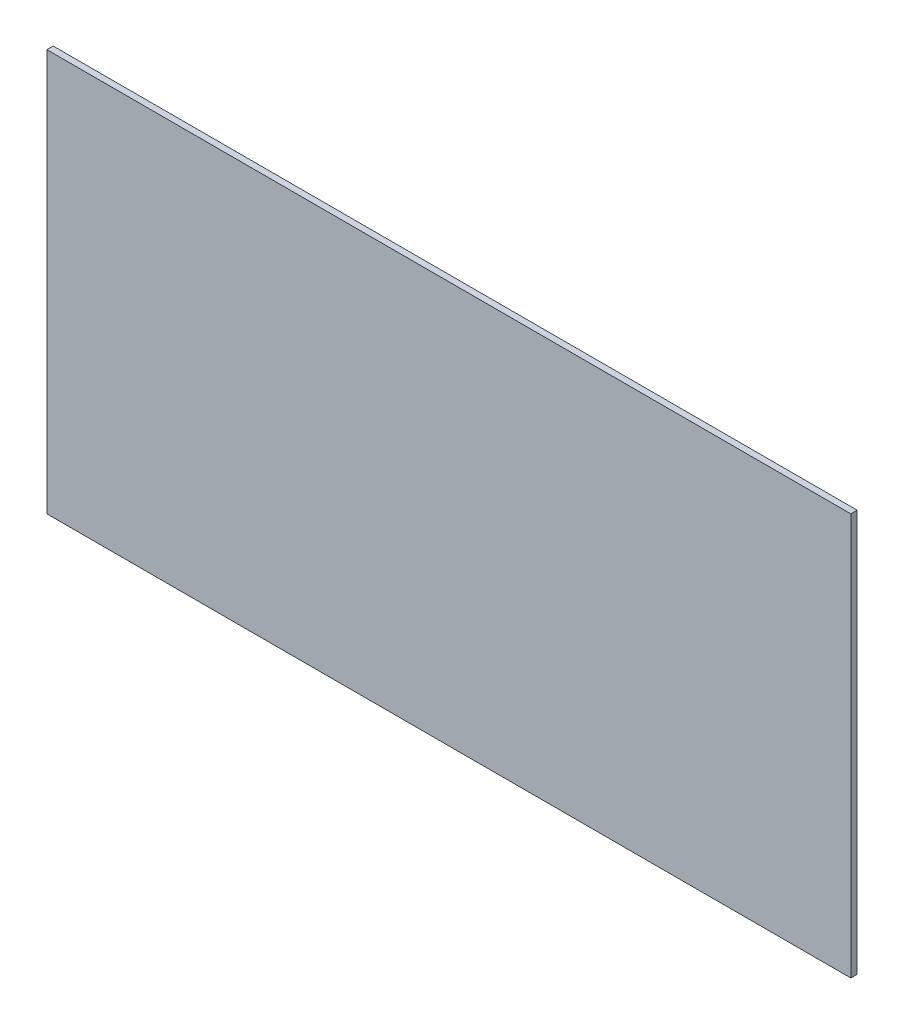
ISO-10303-21;
HEADER;
FILE_DESCRIPTION(('STEP AP214'),'2;1');
FILE_NAME('part.step','',(''),(''),'','','');
FILE_SCHEMA(('AUTOMOTIVE_DESIGN { 1 0 10303 214 1 1 1 1 }'));
ENDSEC;
DATA;
#1=APPLICATION_CONTEXT('core data for automotive mechanical design processes');
#2=APPLICATION_PROTOCOL_DEFINITION('international standard','automotive_design',2000,#1);
#3=PRODUCT_CONTEXT('',#1,'mechanical');
#4=PRODUCT('Part','Part','',(#3));
#5=PRODUCT_RELATED_PRODUCT_CATEGORY('part','',(#4));
#6=PRODUCT_DEFINITION_FORMATION('','',#4);
#7=PRODUCT_DEFINITION_CONTEXT('part definition',#1,'design');
#8=PRODUCT_DEFINITION('design','',#6,#7);
#9=PRODUCT_DEFINITION_SHAPE('','',#8);
#10=(LENGTH_UNIT() NAMED_UNIT(*) SI_UNIT(.MILLI.,.METRE.));
#11=(NAMED_UNIT(*) PLANE_ANGLE_UNIT() SI_UNIT($,.RADIAN.));
#12=(NAMED_UNIT(*) SI_UNIT($,.STERADIAN.) SOLID_ANGLE_UNIT());
#13=UNCERTAINTY_MEASURE_WITH_UNIT(LENGTH_MEASURE(1.E-05),#10,'distance_accuracy_value','');
#14=(GEOMETRIC_REPRESENTATION_CONTEXT(3) GLOBAL_UNCERTAINTY_ASSIGNED_CONTEXT((#13)) GLOBAL_UNIT_ASSIGNED_CONTEXT((#10,
#11,#12)) REPRESENTATION_CONTEXT('',''));
#15=CARTESIAN_POINT('',(0.,0.,0.));
#16=DIRECTION('',(0.,0.,1.));
#17=DIRECTION('',(1.,0.,0.));
#18=AXIS2_PLACEMENT_3D('',#15,#16,#17);
#19=CARTESIAN_POINT('',(0.635,0.3175,0.01));
#20=DIRECTION('',(-1.,0.,0.));
#21=DIRECTION('',(0.,-1.,0.));
#22=AXIS2_PLACEMENT_3D('',#19,#20,#21);
#23=PLANE('',#22);
#24=DIRECTION('',(0.,1.,0.));
#25=VECTOR('',#24,1.);
#26=CARTESIAN_POINT('',(0.635,0.3175,0.));
#27=LINE('',#26,#25);
#28=CARTESIAN_POINT('',(0.635,-0.3175,0.));
#29=VERTEX_POINT('',#28);
#30=CARTESIAN_POINT('',(0.635,0.3175,0.));
#31=VERTEX_POINT('',#30);
#32=EDGE_CURVE('E99',#29,#31,#27,.T.);
#33=ORIENTED_EDGE('',*,*,#32,.T.);
#34=DIRECTION('',(0.,0.,-1.));
#35=VECTOR('',#34,1.);
#36=CARTESIAN_POINT('',(0.635,0.3175,0.01));
#37=LINE('',#36,#35);
#38=CARTESIAN_POINT('',(0.635,0.3175,0.01));
#39=VERTEX_POINT('',#38);
#40=EDGE_CURVE('E11',#39,#31,#37,.T.);
#41=ORIENTED_EDGE('',*,*,#40,.F.);
#42=DIRECTION('',(0.,1.,0.));
#43=VECTOR('',#42,1.);
#44=CARTESIAN_POINT('',(0.635,0.3175,0.01));
#45=LINE('',#44,#43);
#46=CARTESIAN_POINT('',(0.635,-0.3175,0.01));
#47=VERTEX_POINT('',#46);
#48=EDGE_CURVE('E87',#47,#39,#45,.T.);
#49=ORIENTED_EDGE('',*,*,#48,.F.);
#50=DIRECTION('',(0.,0.,-1.));
#51=VECTOR('',#50,1.);
#52=CARTESIAN_POINT('',(0.635,-0.3175,0.01));
#53=LINE('',#52,#51);
#54=EDGE_CURVE('E95',#47,#29,#53,.T.);
#55=ORIENTED_EDGE('',*,*,#54,.T.);
#56=EDGE_LOOP('',(#33,#41,#49,#55));
#57=FACE_BOUND('',#56,.T.);
#58=ADVANCED_FACE('F36',(#57),#23,.F.);
#59=CARTESIAN_POINT('',(-0.635,0.3175,0.01));
#60=DIRECTION('',(0.,-1.,0.));
#61=DIRECTION('',(1.,0.,0.));
#62=AXIS2_PLACEMENT_3D('',#59,#60,#61);
#63=PLANE('',#62);
#64=DIRECTION('',(-1.,0.,0.));
#65=VECTOR('',#64,1.);
#66=CARTESIAN_POINT('',(-0.635,0.3175,0.));
#67=LINE('',#66,#65);
#68=CARTESIAN_POINT('',(-0.635,0.3175,0.));
#69=VERTEX_POINT('',#68);
#70=EDGE_CURVE('E91',#31,#69,#67,.T.);
#71=ORIENTED_EDGE('',*,*,#70,.T.);
#72=DIRECTION('',(0.,0.,-1.));
#73=VECTOR('',#72,1.);
#74=CARTESIAN_POINT('',(-0.635,0.3175,0.01));
#75=LINE('',#74,#73);
#76=CARTESIAN_POINT('',(-0.635,0.3175,0.01));
#77=VERTEX_POINT('',#76);
#78=EDGE_CURVE('E44',#77,#69,#75,.T.);
#79=ORIENTED_EDGE('',*,*,#78,.F.);
#80=DIRECTION('',(-1.,0.,0.));
#81=VECTOR('',#80,1.);
#82=CARTESIAN_POINT('',(-0.635,0.3175,0.01));
#83=LINE('',#82,#81);
#84=EDGE_CURVE('E82',#39,#77,#83,.T.);
#85=ORIENTED_EDGE('',*,*,#84,.F.);
#86=ORIENTED_EDGE('',*,*,#40,.T.);
#87=EDGE_LOOP('',(#71,#79,#85,#86));
#88=FACE_BOUND('',#87,.T.);
#89=ADVANCED_FACE('F90',(#88),#63,.F.);
#90=CARTESIAN_POINT('',(-0.635,-0.3175,0.01));
#91=DIRECTION('',(1.,0.,0.));
#92=DIRECTION('',(0.,1.,0.));
#93=AXIS2_PLACEMENT_3D('',#90,#91,#92);
#94=PLANE('',#93);
#95=DIRECTION('',(0.,-1.,0.));
#96=VECTOR('',#95,1.);
#97=CARTESIAN_POINT('',(-0.635,-0.3175,0.));
#98=LINE('',#97,#96);
#99=CARTESIAN_POINT('',(-0.635,-0.3175,0.));
#100=VERTEX_POINT('',#99);
#101=EDGE_CURVE('E69',#69,#100,#98,.T.);
#102=ORIENTED_EDGE('',*,*,#101,.T.);
#103=DIRECTION('',(0.,0.,-1.));
#104=VECTOR('',#103,1.);
#105=CARTESIAN_POINT('',(-0.635,-0.3175,0.01));
#106=LINE('',#105,#104);
#107=CARTESIAN_POINT('',(-0.635,-0.3175,0.01));
#108=VERTEX_POINT('',#107);
#109=EDGE_CURVE('E92',#108,#100,#106,.T.);
#110=ORIENTED_EDGE('',*,*,#109,.F.);
#111=DIRECTION('',(0.,-1.,0.));
#112=VECTOR('',#111,1.);
#113=CARTESIAN_POINT('',(-0.635,-0.3175,0.01));
#114=LINE('',#113,#112);
#115=EDGE_CURVE('E85',#77,#108,#114,.T.);
#116=ORIENTED_EDGE('',*,*,#115,.F.);
#117=ORIENTED_EDGE('',*,*,#78,.T.);
#118=EDGE_LOOP('',(#102,#110,#116,#117));
#119=FACE_BOUND('',#118,.T.);
#120=ADVANCED_FACE('F93',(#119),#94,.F.);
#121=CARTESIAN_POINT('',(0.635,-0.3175,0.01));
#122=DIRECTION('',(0.,1.,0.));
#123=DIRECTION('',(-1.,0.,0.));
#124=AXIS2_PLACEMENT_3D('',#121,#122,#123);
#125=PLANE('',#124);
#126=DIRECTION('',(1.,0.,0.));
#127=VECTOR('',#126,1.);
#128=CARTESIAN_POINT('',(0.635,-0.3175,0.));
#129=LINE('',#128,#127);
#130=EDGE_CURVE('E75',#100,#29,#129,.T.);
#131=ORIENTED_EDGE('',*,*,#130,.T.);
#132=ORIENTED_EDGE('',*,*,#54,.F.);
#133=DIRECTION('',(1.,0.,0.));
#134=VECTOR('',#133,1.);
#135=CARTESIAN_POINT('',(0.635,-0.3175,0.01));
#136=LINE('',#135,#134);
#137=EDGE_CURVE('E52',#108,#47,#136,.T.);
#138=ORIENTED_EDGE('',*,*,#137,.F.);
#139=ORIENTED_EDGE('',*,*,#109,.T.);
#140=EDGE_LOOP('',(#131,#132,#138,#139));
#141=FACE_BOUND('',#140,.T.);
#142=ADVANCED_FACE('F106',(#141),#125,.F.);
#143=CARTESIAN_POINT('',(0.,0.,0.01));
#144=DIRECTION('',(0.,0.,-1.));
#145=DIRECTION('',(-1.,0.,0.));
#146=AXIS2_PLACEMENT_3D('',#143,#144,#145);
#147=PLANE('',#146);
#148=ORIENTED_EDGE('',*,*,#48,.T.);
#149=ORIENTED_EDGE('',*,*,#84,.T.);
#150=ORIENTED_EDGE('',*,*,#115,.T.);
#151=ORIENTED_EDGE('',*,*,#137,.T.);
#152=EDGE_LOOP('',(#148,#149,#150,#151));
#153=FACE_BOUND('',#152,.T.);
#154=ADVANCED_FACE('F83',(#153),#147,.F.);
#155=CARTESIAN_POINT('',(0.,0.,0.));
#156=DIRECTION('',(0.,0.,-1.));
#157=DIRECTION('',(-1.,0.,0.));
#158=AXIS2_PLACEMENT_3D('',#155,#156,#157);
#159=PLANE('',#158);
#160=ORIENTED_EDGE('',*,*,#32,.F.);
#161=ORIENTED_EDGE('',*,*,#130,.F.);
#162=ORIENTED_EDGE('',*,*,#101,.F.);
#163=ORIENTED_EDGE('',*,*,#70,.F.);
#164=EDGE_LOOP('',(#160,#161,#162,#163));
#165=FACE_BOUND('',#164,.T.);
#166=ADVANCED_FACE('F109',(#165),#159,.T.);
#167=CLOSED_SHELL('',(#58,#89,#120,#142,#154,#166));
#168=MANIFOLD_SOLID_BREP('B2',#167);
#169=ADVANCED_BREP_SHAPE_REPRESENTATION('',(#18,#168),#14);
#170=SHAPE_DEFINITION_REPRESENTATION(#9,#169);
ENDSEC;
END-ISO-10303-21;
